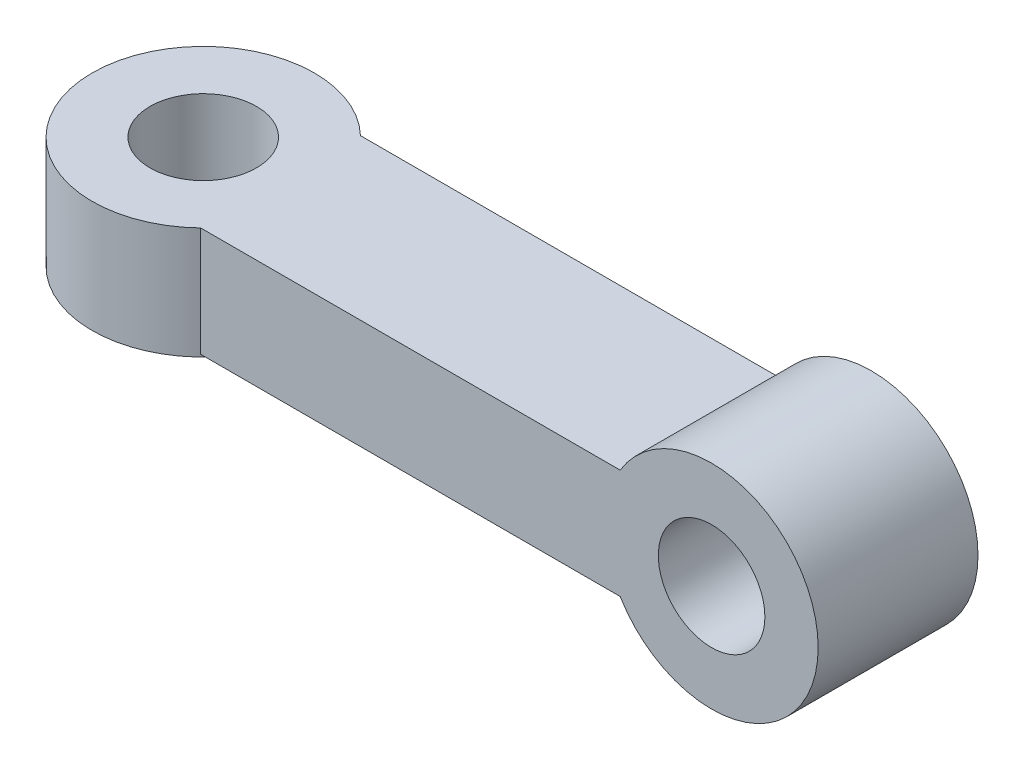
ISO-10303-21;
HEADER;
FILE_DESCRIPTION(('STEP AP214'),'2;1');
FILE_NAME('part.step','',(''),(''),'','','');
FILE_SCHEMA(('AUTOMOTIVE_DESIGN { 1 0 10303 214 1 1 1 1 }'));
ENDSEC;
DATA;
#1=APPLICATION_CONTEXT('core data for automotive mechanical design processes');
#2=APPLICATION_PROTOCOL_DEFINITION('international standard','automotive_design',2000,#1);
#3=PRODUCT_CONTEXT('',#1,'mechanical');
#4=PRODUCT('Part','Part','',(#3));
#5=PRODUCT_RELATED_PRODUCT_CATEGORY('part','',(#4));
#6=PRODUCT_DEFINITION_FORMATION('','',#4);
#7=PRODUCT_DEFINITION_CONTEXT('part definition',#1,'design');
#8=PRODUCT_DEFINITION('design','',#6,#7);
#9=PRODUCT_DEFINITION_SHAPE('','',#8);
#10=(LENGTH_UNIT() NAMED_UNIT(*) SI_UNIT(.MILLI.,.METRE.));
#11=(NAMED_UNIT(*) PLANE_ANGLE_UNIT() SI_UNIT($,.RADIAN.));
#12=(NAMED_UNIT(*) SI_UNIT($,.STERADIAN.) SOLID_ANGLE_UNIT());
#13=UNCERTAINTY_MEASURE_WITH_UNIT(LENGTH_MEASURE(1.E-05),#10,'distance_accuracy_value','');
#14=(GEOMETRIC_REPRESENTATION_CONTEXT(3) GLOBAL_UNCERTAINTY_ASSIGNED_CONTEXT((#13)) GLOBAL_UNIT_ASSIGNED_CONTEXT((#10,
#11,#12)) REPRESENTATION_CONTEXT('',''));
#15=CARTESIAN_POINT('',(0.,0.,0.));
#16=DIRECTION('',(0.,0.,1.));
#17=DIRECTION('',(1.,0.,0.));
#18=AXIS2_PLACEMENT_3D('',#15,#16,#17);
#19=CARTESIAN_POINT('',(110.269891460878,-2.00989612758394,15.));
#20=DIRECTION('',(0.,0.,-1.));
#21=DIRECTION('',(-1.,0.,0.));
#22=AXIS2_PLACEMENT_3D('',#19,#20,#21);
#23=PLANE('',#22);
#24=CARTESIAN_POINT('',(110.269891460878,-2.00989612758394,15.));
#25=DIRECTION('',(0.,0.,1.));
#26=DIRECTION('',(-1.,0.,0.));
#27=AXIS2_PLACEMENT_3D('',#24,#25,#26);
#28=CIRCLE('',#27,9.99999999999999);
#29=CARTESIAN_POINT('',(101.689180825993,-7.14520575801294,15.));
#30=VERTEX_POINT('',#29);
#31=CARTESIAN_POINT('',(101.689180825993,3.12541350284507,15.));
#32=VERTEX_POINT('',#31);
#33=EDGE_CURVE('E76',#30,#32,#28,.T.);
#34=ORIENTED_EDGE('',*,*,#33,.T.);
#35=DIRECTION('',(-1.,0.,0.));
#36=VECTOR('',#35,1.);
#37=CARTESIAN_POINT('',(101.689180825993,3.12541350284507,15.));
#38=LINE('',#37,#36);
#39=CARTESIAN_POINT('',(62.3191808259933,3.12541350284506,15.));
#40=VERTEX_POINT('',#39);
#41=EDGE_CURVE('E103',#32,#40,#38,.T.);
#42=ORIENTED_EDGE('',*,*,#41,.T.);
#43=DIRECTION('',(0.,-1.,0.));
#44=VECTOR('',#43,1.);
#45=CARTESIAN_POINT('',(62.3191808259933,-7.14520575801295,15.));
#46=LINE('',#45,#44);
#47=CARTESIAN_POINT('',(62.3191808259933,-7.14520575801295,15.));
#48=VERTEX_POINT('',#47);
#49=EDGE_CURVE('E106',#40,#48,#46,.T.);
#50=ORIENTED_EDGE('',*,*,#49,.T.);
#51=DIRECTION('',(1.,0.,0.));
#52=VECTOR('',#51,1.);
#53=CARTESIAN_POINT('',(101.689180825993,-7.14520575801294,15.));
#54=LINE('',#53,#52);
#55=EDGE_CURVE('E50',#48,#30,#54,.T.);
#56=ORIENTED_EDGE('',*,*,#55,.T.);
#57=EDGE_LOOP('',(#34,#42,#50,#56));
#58=FACE_BOUND('',#57,.T.);
#59=CARTESIAN_POINT('',(110.269891460878,-2.00989612758394,15.));
#60=DIRECTION('',(0.,0.,1.));
#61=DIRECTION('',(1.,0.,0.));
#62=AXIS2_PLACEMENT_3D('',#59,#60,#61);
#63=CIRCLE('',#62,5.);
#64=CARTESIAN_POINT('',(115.269891460878,-2.00989612758394,15.));
#65=VERTEX_POINT('',#64);
#66=EDGE_CURVE('E88',#65,#65,#63,.T.);
#67=ORIENTED_EDGE('',*,*,#66,.F.);
#68=EDGE_LOOP('',(#67));
#69=FACE_BOUND('',#68,.T.);
#70=ADVANCED_FACE('F33',(#58,#69),#23,.F.);
#71=CARTESIAN_POINT('',(110.269891460878,-2.00989612758394,0.));
#72=DIRECTION('',(0.,0.,-1.));
#73=DIRECTION('',(-1.,0.,0.));
#74=AXIS2_PLACEMENT_3D('',#71,#72,#73);
#75=PLANE('',#74);
#76=CARTESIAN_POINT('',(110.269891460878,-2.00989612758394,0.));
#77=DIRECTION('',(0.,0.,1.));
#78=DIRECTION('',(-1.,0.,0.));
#79=AXIS2_PLACEMENT_3D('',#76,#77,#78);
#80=CIRCLE('',#79,9.99999999999999);
#81=CARTESIAN_POINT('',(101.689180825993,-7.14520575801294,0.));
#82=VERTEX_POINT('',#81);
#83=CARTESIAN_POINT('',(101.689180825993,3.12541350284507,0.));
#84=VERTEX_POINT('',#83);
#85=EDGE_CURVE('E81',#82,#84,#80,.T.);
#86=ORIENTED_EDGE('',*,*,#85,.F.);
#87=DIRECTION('',(1.,0.,0.));
#88=VECTOR('',#87,1.);
#89=CARTESIAN_POINT('',(101.689180825993,-7.14520575801294,0.));
#90=LINE('',#89,#88);
#91=CARTESIAN_POINT('',(62.3191808259933,-7.14520575801295,0.));
#92=VERTEX_POINT('',#91);
#93=EDGE_CURVE('E69',#92,#82,#90,.T.);
#94=ORIENTED_EDGE('',*,*,#93,.F.);
#95=DIRECTION('',(0.,-1.,0.));
#96=VECTOR('',#95,1.);
#97=CARTESIAN_POINT('',(62.3191808259933,-7.14520575801295,0.));
#98=LINE('',#97,#96);
#99=CARTESIAN_POINT('',(62.3191808259933,3.12541350284506,0.));
#100=VERTEX_POINT('',#99);
#101=EDGE_CURVE('E65',#100,#92,#98,.T.);
#102=ORIENTED_EDGE('',*,*,#101,.F.);
#103=DIRECTION('',(-1.,0.,0.));
#104=VECTOR('',#103,1.);
#105=CARTESIAN_POINT('',(101.689180825993,3.12541350284507,0.));
#106=LINE('',#105,#104);
#107=EDGE_CURVE('E86',#84,#100,#106,.T.);
#108=ORIENTED_EDGE('',*,*,#107,.F.);
#109=EDGE_LOOP('',(#86,#94,#102,#108));
#110=FACE_BOUND('',#109,.T.);
#111=CARTESIAN_POINT('',(110.269891460878,-2.00989612758394,0.));
#112=DIRECTION('',(0.,0.,1.));
#113=DIRECTION('',(1.,0.,0.));
#114=AXIS2_PLACEMENT_3D('',#111,#112,#113);
#115=CIRCLE('',#114,5.);
#116=CARTESIAN_POINT('',(115.269891460878,-2.00989612758394,0.));
#117=VERTEX_POINT('',#116);
#118=EDGE_CURVE('E92',#117,#117,#115,.T.);
#119=ORIENTED_EDGE('',*,*,#118,.T.);
#120=EDGE_LOOP('',(#119));
#121=FACE_BOUND('',#120,.T.);
#122=ADVANCED_FACE('F83',(#110,#121),#75,.T.);
#123=CARTESIAN_POINT('',(110.269891460878,-2.00989612758394,15.));
#124=DIRECTION('',(0.,0.,-1.));
#125=DIRECTION('',(-1.,0.,0.));
#126=AXIS2_PLACEMENT_3D('',#123,#124,#125);
#127=CYLINDRICAL_SURFACE('',#126,9.99999999999999);
#128=ORIENTED_EDGE('',*,*,#85,.T.);
#129=DIRECTION('',(0.,0.,-1.));
#130=VECTOR('',#129,1.);
#131=CARTESIAN_POINT('',(101.689180825993,3.12541350284507,15.));
#132=LINE('',#131,#130);
#133=EDGE_CURVE('E42',#32,#84,#132,.T.);
#134=ORIENTED_EDGE('',*,*,#133,.F.);
#135=ORIENTED_EDGE('',*,*,#33,.F.);
#136=DIRECTION('',(0.,0.,-1.));
#137=VECTOR('',#136,1.);
#138=CARTESIAN_POINT('',(101.689180825993,-7.14520575801294,15.));
#139=LINE('',#138,#137);
#140=EDGE_CURVE('E72',#30,#82,#139,.T.);
#141=ORIENTED_EDGE('',*,*,#140,.T.);
#142=EDGE_LOOP('',(#128,#134,#135,#141));
#143=FACE_BOUND('',#142,.T.);
#144=ADVANCED_FACE('F35',(#143),#127,.T.);
#145=CARTESIAN_POINT('',(101.689180825993,3.12541350284507,15.));
#146=DIRECTION('',(0.,-1.,0.));
#147=DIRECTION('',(1.,0.,0.));
#148=AXIS2_PLACEMENT_3D('',#145,#146,#147);
#149=PLANE('',#148);
#150=ORIENTED_EDGE('',*,*,#107,.T.);
#151=CARTESIAN_POINT('',(55.0639644832172,3.12541350284506,7.5));
#152=DIRECTION('',(0.,1.,0.));
#153=DIRECTION('',(-1.,0.,0.));
#154=AXIS2_PLACEMENT_3D('',#151,#152,#153);
#155=CIRCLE('',#154,10.43494917);
#156=EDGE_CURVE('E105',#100,#40,#155,.T.);
#157=ORIENTED_EDGE('',*,*,#156,.T.);
#158=ORIENTED_EDGE('',*,*,#41,.F.);
#159=ORIENTED_EDGE('',*,*,#133,.T.);
#160=EDGE_LOOP('',(#150,#157,#158,#159));
#161=FACE_BOUND('',#160,.T.);
#162=CARTESIAN_POINT('',(55.0639644832172,3.12541350284506,7.5));
#163=DIRECTION('',(0.,1.,0.));
#164=DIRECTION('',(-1.,0.,0.));
#165=AXIS2_PLACEMENT_3D('',#162,#163,#164);
#166=CIRCLE('',#165,5.);
#167=CARTESIAN_POINT('',(50.0639644832172,3.12541350284506,7.5));
#168=VERTEX_POINT('',#167);
#169=EDGE_CURVE('E121',#168,#168,#166,.T.);
#170=ORIENTED_EDGE('',*,*,#169,.F.);
#171=EDGE_LOOP('',(#170));
#172=FACE_BOUND('',#171,.T.);
#173=ADVANCED_FACE('F98',(#161,#172),#149,.F.);
#174=CARTESIAN_POINT('',(101.689180825993,-7.14520575801294,15.));
#175=DIRECTION('',(0.,1.,0.));
#176=DIRECTION('',(-1.,0.,0.));
#177=AXIS2_PLACEMENT_3D('',#174,#175,#176);
#178=PLANE('',#177);
#179=ORIENTED_EDGE('',*,*,#55,.F.);
#180=CARTESIAN_POINT('',(55.0639644832172,-7.14520575801295,7.5));
#181=DIRECTION('',(0.,1.,0.));
#182=DIRECTION('',(-1.,0.,0.));
#183=AXIS2_PLACEMENT_3D('',#180,#181,#182);
#184=CIRCLE('',#183,10.43494917);
#185=EDGE_CURVE('E11',#48,#92,#184,.T.);
#186=ORIENTED_EDGE('',*,*,#185,.T.);
#187=ORIENTED_EDGE('',*,*,#93,.T.);
#188=ORIENTED_EDGE('',*,*,#140,.F.);
#189=EDGE_LOOP('',(#179,#186,#187,#188));
#190=FACE_BOUND('',#189,.T.);
#191=ADVANCED_FACE('F71',(#190),#178,.F.);
#192=CARTESIAN_POINT('',(110.269891460878,-2.00989612758394,15.));
#193=DIRECTION('',(0.,0.,-1.));
#194=DIRECTION('',(-1.,0.,0.));
#195=AXIS2_PLACEMENT_3D('',#192,#193,#194);
#196=CYLINDRICAL_SURFACE('',#195,5.);
#197=ORIENTED_EDGE('',*,*,#66,.T.);
#198=EDGE_LOOP('',(#197));
#199=FACE_BOUND('',#198,.T.);
#200=ORIENTED_EDGE('',*,*,#118,.F.);
#201=EDGE_LOOP('',(#200));
#202=FACE_BOUND('',#201,.T.);
#203=ADVANCED_FACE('F133',(#199,#202),#196,.F.);
#204=CARTESIAN_POINT('',(55.0639644832172,-7.37458649715494,7.5));
#205=DIRECTION('',(0.,1.,0.));
#206=DIRECTION('',(-1.,0.,0.));
#207=AXIS2_PLACEMENT_3D('',#204,#205,#206);
#208=CYLINDRICAL_SURFACE('',#207,10.43494917);
#209=CARTESIAN_POINT('',(55.0639644832172,-7.37458649715494,7.5));
#210=DIRECTION('',(0.,1.,0.));
#211=DIRECTION('',(-1.,0.,0.));
#212=AXIS2_PLACEMENT_3D('',#209,#210,#211);
#213=CIRCLE('',#212,10.43494917);
#214=CARTESIAN_POINT('',(44.6290153132172,-7.37458649715494,7.5));
#215=VERTEX_POINT('',#214);
#216=EDGE_CURVE('E115',#215,#215,#213,.T.);
#217=ORIENTED_EDGE('',*,*,#216,.T.);
#218=EDGE_LOOP('',(#217));
#219=FACE_BOUND('',#218,.T.);
#220=ORIENTED_EDGE('',*,*,#101,.T.);
#221=ORIENTED_EDGE('',*,*,#185,.F.);
#222=ORIENTED_EDGE('',*,*,#49,.F.);
#223=ORIENTED_EDGE('',*,*,#156,.F.);
#224=EDGE_LOOP('',(#220,#221,#222,#223));
#225=FACE_BOUND('',#224,.T.);
#226=ADVANCED_FACE('F112',(#219,#225),#208,.T.);
#227=CARTESIAN_POINT('',(55.0639644832172,-7.37458649715494,7.5));
#228=DIRECTION('',(0.,1.,0.));
#229=DIRECTION('',(-1.,0.,0.));
#230=AXIS2_PLACEMENT_3D('',#227,#228,#229);
#231=PLANE('',#230);
#232=CARTESIAN_POINT('',(55.0639644832172,-7.37458649715494,7.5));
#233=DIRECTION('',(0.,1.,0.));
#234=DIRECTION('',(-1.,0.,0.));
#235=AXIS2_PLACEMENT_3D('',#232,#233,#234);
#236=CIRCLE('',#235,5.);
#237=CARTESIAN_POINT('',(50.0639644832172,-7.37458649715494,7.5));
#238=VERTEX_POINT('',#237);
#239=EDGE_CURVE('E116',#238,#238,#236,.T.);
#240=ORIENTED_EDGE('',*,*,#239,.T.);
#241=EDGE_LOOP('',(#240));
#242=FACE_BOUND('',#241,.T.);
#243=ORIENTED_EDGE('',*,*,#216,.F.);
#244=EDGE_LOOP('',(#243));
#245=FACE_BOUND('',#244,.T.);
#246=ADVANCED_FACE('F147',(#242,#245),#231,.F.);
#247=CARTESIAN_POINT('',(55.0639644832172,-7.37458649715494,7.5));
#248=DIRECTION('',(0.,1.,0.));
#249=DIRECTION('',(-1.,0.,0.));
#250=AXIS2_PLACEMENT_3D('',#247,#248,#249);
#251=CYLINDRICAL_SURFACE('',#250,5.);
#252=CARTESIAN_POINT('',(50.0639644832172,-7.37458649715494,7.5));
#253=CARTESIAN_POINT('',(50.0639644832172,-7.26521149715494,7.5));
#254=CARTESIAN_POINT('',(50.0639644832172,-7.15583649715494,7.5));
#255=CARTESIAN_POINT('',(50.0639644832172,-6.93708649715494,7.5));
#256=CARTESIAN_POINT('',(50.0639644832172,-6.82771149715494,7.5));
#257=CARTESIAN_POINT('',(50.0639644832172,-6.60896149715494,7.5));
#258=CARTESIAN_POINT('',(50.0639644832172,-6.49958649715494,7.5));
#259=CARTESIAN_POINT('',(50.0639644832172,-6.28083649715494,7.5));
#260=CARTESIAN_POINT('',(50.0639644832172,-6.17146149715494,7.5));
#261=CARTESIAN_POINT('',(50.0639644832172,-5.95271149715494,7.5));
#262=CARTESIAN_POINT('',(50.0639644832172,-5.84333649715494,7.5));
#263=CARTESIAN_POINT('',(50.0639644832172,-5.62458649715494,7.5));
#264=CARTESIAN_POINT('',(50.0639644832172,-5.51521149715494,7.5));
#265=CARTESIAN_POINT('',(50.0639644832172,-5.29646149715494,7.5));
#266=CARTESIAN_POINT('',(50.0639644832172,-5.18708649715494,7.5));
#267=CARTESIAN_POINT('',(50.0639644832172,-4.96833649715494,7.5));
#268=CARTESIAN_POINT('',(50.0639644832172,-4.85896149715494,7.5));
#269=CARTESIAN_POINT('',(50.0639644832172,-4.64021149715494,7.5));
#270=CARTESIAN_POINT('',(50.0639644832172,-4.53083649715494,7.5));
#271=CARTESIAN_POINT('',(50.0639644832172,-4.31208649715494,7.5));
#272=CARTESIAN_POINT('',(50.0639644832172,-4.20271149715494,7.5));
#273=CARTESIAN_POINT('',(50.0639644832172,-3.98396149715494,7.5));
#274=CARTESIAN_POINT('',(50.0639644832172,-3.87458649715494,7.5));
#275=CARTESIAN_POINT('',(50.0639644832172,-3.65583649715494,7.5));
#276=CARTESIAN_POINT('',(50.0639644832172,-3.54646149715494,7.5));
#277=CARTESIAN_POINT('',(50.0639644832172,-3.32771149715494,7.5));
#278=CARTESIAN_POINT('',(50.0639644832172,-3.21833649715494,7.5));
#279=CARTESIAN_POINT('',(50.0639644832172,-2.99958649715494,7.5));
#280=CARTESIAN_POINT('',(50.0639644832172,-2.89021149715494,7.5));
#281=CARTESIAN_POINT('',(50.0639644832172,-2.67146149715494,7.5));
#282=CARTESIAN_POINT('',(50.0639644832172,-2.56208649715494,7.5));
#283=CARTESIAN_POINT('',(50.0639644832172,-2.34333649715494,7.5));
#284=CARTESIAN_POINT('',(50.0639644832172,-2.23396149715494,7.5));
#285=CARTESIAN_POINT('',(50.0639644832172,-2.01521149715494,7.5));
#286=CARTESIAN_POINT('',(50.0639644832172,-1.90583649715494,7.5));
#287=CARTESIAN_POINT('',(50.0639644832172,-1.68708649715494,7.5));
#288=CARTESIAN_POINT('',(50.0639644832172,-1.57771149715494,7.5));
#289=CARTESIAN_POINT('',(50.0639644832172,-1.35896149715494,7.5));
#290=CARTESIAN_POINT('',(50.0639644832172,-1.24958649715494,7.5));
#291=CARTESIAN_POINT('',(50.0639644832172,-1.03083649715494,7.5));
#292=CARTESIAN_POINT('',(50.0639644832172,-0.921461497154938,7.5));
#293=CARTESIAN_POINT('',(50.0639644832172,-0.702711497154938,7.5));
#294=CARTESIAN_POINT('',(50.0639644832172,-0.593336497154938,7.5));
#295=CARTESIAN_POINT('',(50.0639644832172,-0.374586497154938,7.5));
#296=CARTESIAN_POINT('',(50.0639644832172,-0.265211497154938,7.5));
#297=CARTESIAN_POINT('',(50.0639644832172,-0.0464614971549381,7.5));
#298=CARTESIAN_POINT('',(50.0639644832172,0.062913502845062,7.5));
#299=CARTESIAN_POINT('',(50.0639644832172,0.281663502845062,7.5));
#300=CARTESIAN_POINT('',(50.0639644832172,0.391038502845062,7.5));
#301=CARTESIAN_POINT('',(50.0639644832172,0.609788502845062,7.5));
#302=CARTESIAN_POINT('',(50.0639644832172,0.719163502845062,7.5));
#303=CARTESIAN_POINT('',(50.0639644832172,0.937913502845062,7.5));
#304=CARTESIAN_POINT('',(50.0639644832172,1.04728850284506,7.5));
#305=CARTESIAN_POINT('',(50.0639644832172,1.26603850284506,7.5));
#306=CARTESIAN_POINT('',(50.0639644832172,1.37541350284506,7.5));
#307=CARTESIAN_POINT('',(50.0639644832172,1.59416350284506,7.5));
#308=CARTESIAN_POINT('',(50.0639644832172,1.70353850284506,7.5));
#309=CARTESIAN_POINT('',(50.0639644832172,1.92228850284506,7.5));
#310=CARTESIAN_POINT('',(50.0639644832172,2.03166350284506,7.5));
#311=CARTESIAN_POINT('',(50.0639644832172,2.25041350284506,7.5));
#312=CARTESIAN_POINT('',(50.0639644832172,2.35978850284506,7.5));
#313=CARTESIAN_POINT('',(50.0639644832172,2.57853850284506,7.5));
#314=CARTESIAN_POINT('',(50.0639644832172,2.68791350284506,7.5));
#315=CARTESIAN_POINT('',(50.0639644832172,2.90666350284506,7.5));
#316=CARTESIAN_POINT('',(50.0639644832172,3.01603850284506,7.5));
#317=CARTESIAN_POINT('',(50.0639644832172,3.12541350284506,7.5));
#318=B_SPLINE_CURVE_WITH_KNOTS('',3,(#252,#253,#254,#255,#256,#257,#258,#259,#260,#261,#262,
#263,#264,#265,#266,#267,#268,#269,#270,#271,#272,#273,#274,#275,#276,#277,#278,#279,#280,#281,
#282,#283,#284,#285,#286,#287,#288,#289,#290,#291,#292,#293,#294,#295,#296,#297,#298,#299,#300,
#301,#302,#303,#304,#305,#306,#307,#308,#309,#310,#311,#312,#313,#314,#315,#316,#317),
.UNSPECIFIED.,.F.,.F.,(4,2,2,2,2,2,2,2,2,2,2,2,2,2,2,2,2,2,2,2,2,2,2,2,2,2,2,2,2,2,2,2,4),(0.,
0.328125,0.656250000000001,0.984375,1.3125,1.640625,1.96875,2.296875,2.625,2.953125,3.28125,
3.609375,3.9375,4.265625,4.59375,4.921875,5.25,5.578125,5.90625,6.234375,6.5625,6.890625,
7.21875,7.546875,7.875,8.203125,8.53125,8.859375,9.1875,9.515625,9.84375,10.171875,10.5),.UNSPECIFIED.);
#319=EDGE_CURVE('BSEAM127',#238,#168,#318,.T.);
#320=ORIENTED_EDGE('',*,*,#239,.F.);
#321=ORIENTED_EDGE('',*,*,#169,.T.);
#322=ORIENTED_EDGE('',*,*,#319,.T.);
#323=ORIENTED_EDGE('',*,*,#319,.F.);
#324=EDGE_LOOP('',(#320,#322,#321,#323));
#325=FACE_BOUND('',#324,.T.);
#326=ADVANCED_FACE('F127',(#325),#251,.F.);
#327=CLOSED_SHELL('',(#70,#122,#144,#173,#191,#203,#226,#246,#326));
#328=MANIFOLD_SOLID_BREP('B2',#327);
#329=ADVANCED_BREP_SHAPE_REPRESENTATION('',(#18,#328),#14);
#330=SHAPE_DEFINITION_REPRESENTATION(#9,#329);
ENDSEC;
END-ISO-10303-21;
